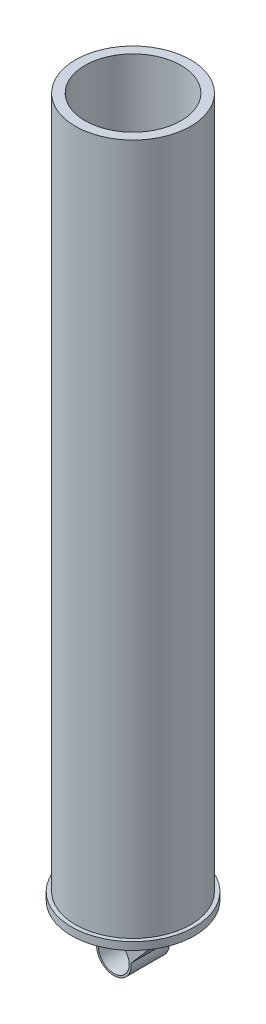
ISO-10303-21;
HEADER;
FILE_DESCRIPTION(('STEP AP214'),'2;1');
FILE_NAME('part.step','',(''),(''),'','','');
FILE_SCHEMA(('AUTOMOTIVE_DESIGN { 1 0 10303 214 1 1 1 1 }'));
ENDSEC;
DATA;
#1=APPLICATION_CONTEXT('core data for automotive mechanical design processes');
#2=APPLICATION_PROTOCOL_DEFINITION('international standard','automotive_design',2000,#1);
#3=PRODUCT_CONTEXT('',#1,'mechanical');
#4=PRODUCT('Part','Part','',(#3));
#5=PRODUCT_RELATED_PRODUCT_CATEGORY('part','',(#4));
#6=PRODUCT_DEFINITION_FORMATION('','',#4);
#7=PRODUCT_DEFINITION_CONTEXT('part definition',#1,'design');
#8=PRODUCT_DEFINITION('design','',#6,#7);
#9=PRODUCT_DEFINITION_SHAPE('','',#8);
#10=(LENGTH_UNIT() NAMED_UNIT(*) SI_UNIT(.MILLI.,.METRE.));
#11=(NAMED_UNIT(*) PLANE_ANGLE_UNIT() SI_UNIT($,.RADIAN.));
#12=(NAMED_UNIT(*) SI_UNIT($,.STERADIAN.) SOLID_ANGLE_UNIT());
#13=UNCERTAINTY_MEASURE_WITH_UNIT(LENGTH_MEASURE(1.E-05),#10,'distance_accuracy_value','');
#14=(GEOMETRIC_REPRESENTATION_CONTEXT(3) GLOBAL_UNCERTAINTY_ASSIGNED_CONTEXT((#13)) GLOBAL_UNIT_ASSIGNED_CONTEXT((#10,
#11,#12)) REPRESENTATION_CONTEXT('',''));
#15=CARTESIAN_POINT('',(0.,0.,0.));
#16=DIRECTION('',(0.,0.,1.));
#17=DIRECTION('',(1.,0.,0.));
#18=AXIS2_PLACEMENT_3D('',#15,#16,#17);
#19=CARTESIAN_POINT('',(0.,1800.,0.));
#20=DIRECTION('',(0.,1.,0.));
#21=DIRECTION('',(0.,0.,1.));
#22=AXIS2_PLACEMENT_3D('',#19,#20,#21);
#23=PLANE('',#22);
#24=CARTESIAN_POINT('',(0.,1800.,0.));
#25=DIRECTION('',(0.,1.,0.));
#26=DIRECTION('',(0.,0.,1.));
#27=AXIS2_PLACEMENT_3D('',#24,#25,#26);
#28=CIRCLE('',#27,150.);
#29=CARTESIAN_POINT('',(0.,1800.,150.));
#30=VERTEX_POINT('',#29);
#31=EDGE_CURVE('E11',#30,#30,#28,.T.);
#32=ORIENTED_EDGE('',*,*,#31,.T.);
#33=EDGE_LOOP('',(#32));
#34=FACE_BOUND('',#33,.T.);
#35=CARTESIAN_POINT('',(0.,1800.,0.));
#36=DIRECTION('',(0.,1.,0.));
#37=DIRECTION('',(0.,0.,1.));
#38=AXIS2_PLACEMENT_3D('',#35,#36,#37);
#39=CIRCLE('',#38,125.);
#40=CARTESIAN_POINT('',(0.,1800.,125.));
#41=VERTEX_POINT('',#40);
#42=EDGE_CURVE('E44',#41,#41,#39,.T.);
#43=ORIENTED_EDGE('',*,*,#42,.F.);
#44=EDGE_LOOP('',(#43));
#45=FACE_BOUND('',#44,.T.);
#46=ADVANCED_FACE('F35',(#34,#45),#23,.T.);
#47=CARTESIAN_POINT('',(0.,1800.,0.));
#48=DIRECTION('',(0.,-1.,0.));
#49=DIRECTION('',(0.,0.,-1.));
#50=AXIS2_PLACEMENT_3D('',#47,#48,#49);
#51=CYLINDRICAL_SURFACE('',#50,150.);
#52=ORIENTED_EDGE('',*,*,#31,.F.);
#53=EDGE_LOOP('',(#52));
#54=FACE_BOUND('',#53,.T.);
#55=CARTESIAN_POINT('',(0.,0.,0.));
#56=DIRECTION('',(0.,1.,0.));
#57=DIRECTION('',(0.,0.,1.));
#58=AXIS2_PLACEMENT_3D('',#55,#56,#57);
#59=CIRCLE('',#58,150.);
#60=CARTESIAN_POINT('',(0.,0.,150.));
#61=VERTEX_POINT('',#60);
#62=EDGE_CURVE('E39',#61,#61,#59,.T.);
#63=ORIENTED_EDGE('',*,*,#62,.T.);
#64=EDGE_LOOP('',(#63));
#65=FACE_BOUND('',#64,.T.);
#66=ADVANCED_FACE('F37',(#54,#65),#51,.T.);
#67=CARTESIAN_POINT('',(0.,1800.,0.));
#68=DIRECTION('',(0.,-1.,0.));
#69=DIRECTION('',(0.,0.,-1.));
#70=AXIS2_PLACEMENT_3D('',#67,#68,#69);
#71=CYLINDRICAL_SURFACE('',#70,125.);
#72=ORIENTED_EDGE('',*,*,#42,.T.);
#73=EDGE_LOOP('',(#72));
#74=FACE_BOUND('',#73,.T.);
#75=CARTESIAN_POINT('',(0.,0.,0.));
#76=DIRECTION('',(0.,1.,0.));
#77=DIRECTION('',(0.,0.,1.));
#78=AXIS2_PLACEMENT_3D('',#75,#76,#77);
#79=CIRCLE('',#78,125.);
#80=CARTESIAN_POINT('',(0.,0.,125.));
#81=VERTEX_POINT('',#80);
#82=EDGE_CURVE('E132',#81,#81,#79,.T.);
#83=ORIENTED_EDGE('',*,*,#82,.F.);
#84=EDGE_LOOP('',(#83));
#85=FACE_BOUND('',#84,.T.);
#86=ADVANCED_FACE('F157',(#74,#85),#71,.F.);
#87=CARTESIAN_POINT('',(0.,0.,0.));
#88=DIRECTION('',(0.,-1.,0.));
#89=DIRECTION('',(0.,0.,-1.));
#90=AXIS2_PLACEMENT_3D('',#87,#88,#89);
#91=PLANE('',#90);
#92=ORIENTED_EDGE('',*,*,#82,.T.);
#93=EDGE_LOOP('',(#92));
#94=FACE_BOUND('',#93,.T.);
#95=ADVANCED_FACE('F145',(#94),#91,.F.);
#96=CARTESIAN_POINT('',(0.,-20.,0.));
#97=DIRECTION('',(0.,1.,0.));
#98=DIRECTION('',(0.,0.,1.));
#99=AXIS2_PLACEMENT_3D('',#96,#97,#98);
#100=CYLINDRICAL_SURFACE('',#99,160.);
#101=CARTESIAN_POINT('',(0.,-20.,0.));
#102=DIRECTION('',(0.,-1.,0.));
#103=DIRECTION('',(0.,0.,-1.));
#104=AXIS2_PLACEMENT_3D('',#101,#102,#103);
#105=CIRCLE('',#104,160.);
#106=CARTESIAN_POINT('',(0.,-20.,-160.));
#107=VERTEX_POINT('',#106);
#108=EDGE_CURVE('E125',#107,#107,#105,.T.);
#109=ORIENTED_EDGE('',*,*,#108,.F.);
#110=EDGE_LOOP('',(#109));
#111=FACE_BOUND('',#110,.T.);
#112=CARTESIAN_POINT('',(0.,0.,0.));
#113=DIRECTION('',(0.,-1.,0.));
#114=DIRECTION('',(0.,0.,-1.));
#115=AXIS2_PLACEMENT_3D('',#112,#113,#114);
#116=CIRCLE('',#115,160.);
#117=CARTESIAN_POINT('',(0.,0.,-160.));
#118=VERTEX_POINT('',#117);
#119=EDGE_CURVE('E124',#118,#118,#116,.T.);
#120=ORIENTED_EDGE('',*,*,#119,.T.);
#121=EDGE_LOOP('',(#120));
#122=FACE_BOUND('',#121,.T.);
#123=ADVANCED_FACE('F148',(#111,#122),#100,.T.);
#124=CARTESIAN_POINT('',(0.,-20.,0.));
#125=DIRECTION('',(0.,-1.,0.));
#126=DIRECTION('',(0.,0.,-1.));
#127=AXIS2_PLACEMENT_3D('',#124,#125,#126);
#128=PLANE('',#127);
#129=DIRECTION('',(1.,0.,0.));
#130=VECTOR('',#129,1.);
#131=CARTESIAN_POINT('',(0.,-20.,-50.));
#132=LINE('',#131,#130);
#133=CARTESIAN_POINT('',(-123.818976335371,-20.,-50.));
#134=VERTEX_POINT('',#133);
#135=CARTESIAN_POINT('',(126.469944209267,-20.,-50.));
#136=VERTEX_POINT('',#135);
#137=EDGE_CURVE('E51',#134,#136,#132,.T.);
#138=ORIENTED_EDGE('',*,*,#137,.F.);
#139=DIRECTION('',(0.,0.,-1.));
#140=VECTOR('',#139,1.);
#141=CARTESIAN_POINT('',(-123.818976335371,-20.,50.));
#142=LINE('',#141,#140);
#143=CARTESIAN_POINT('',(-123.818976335371,-20.,50.));
#144=VERTEX_POINT('',#143);
#145=EDGE_CURVE('E99',#144,#134,#142,.T.);
#146=ORIENTED_EDGE('',*,*,#145,.F.);
#147=DIRECTION('',(1.,0.,0.));
#148=VECTOR('',#147,1.);
#149=CARTESIAN_POINT('',(0.,-20.,50.));
#150=LINE('',#149,#148);
#151=CARTESIAN_POINT('',(126.469944209267,-20.,50.));
#152=VERTEX_POINT('',#151);
#153=EDGE_CURVE('E89',#144,#152,#150,.T.);
#154=ORIENTED_EDGE('',*,*,#153,.T.);
#155=DIRECTION('',(0.,0.,-1.));
#156=VECTOR('',#155,1.);
#157=CARTESIAN_POINT('',(126.469944209267,-20.,50.));
#158=LINE('',#157,#156);
#159=EDGE_CURVE('E94',#152,#136,#158,.T.);
#160=ORIENTED_EDGE('',*,*,#159,.T.);
#161=EDGE_LOOP('',(#138,#146,#154,#160));
#162=FACE_BOUND('',#161,.T.);
#163=ORIENTED_EDGE('',*,*,#108,.T.);
#164=EDGE_LOOP('',(#163));
#165=FACE_BOUND('',#164,.T.);
#166=ADVANCED_FACE('F102',(#162,#165),#128,.T.);
#167=ORIENTED_EDGE('',*,*,#62,.F.);
#168=EDGE_LOOP('',(#167));
#169=FACE_BOUND('',#168,.T.);
#170=ORIENTED_EDGE('',*,*,#119,.F.);
#171=EDGE_LOOP('',(#170));
#172=FACE_BOUND('',#171,.T.);
#173=ADVANCED_FACE('F140',(#169,#172),#91,.F.);
#174=CARTESIAN_POINT('',(0.,-119.791280472536,50.));
#175=DIRECTION('',(0.,0.,-1.));
#176=DIRECTION('',(-1.,0.,0.));
#177=AXIS2_PLACEMENT_3D('',#174,#175,#176);
#178=CYLINDRICAL_SURFACE('',#177,45.);
#179=CARTESIAN_POINT('',(0.,-119.791280472536,-50.));
#180=DIRECTION('',(0.,0.,1.));
#181=DIRECTION('',(1.,0.,0.));
#182=AXIS2_PLACEMENT_3D('',#179,#180,#181);
#183=CIRCLE('',#182,45.);
#184=CARTESIAN_POINT('',(-44.6571141967103,-114.246719928906,-50.));
#185=VERTEX_POINT('',#184);
#186=CARTESIAN_POINT('',(44.6753535547206,-114.395654025059,-50.));
#187=VERTEX_POINT('',#186);
#188=EDGE_CURVE('E112',#185,#187,#183,.T.);
#189=ORIENTED_EDGE('',*,*,#188,.T.);
#190=DIRECTION('',(0.,0.,-1.));
#191=VECTOR('',#190,1.);
#192=CARTESIAN_POINT('',(44.6753535547206,-114.395654025059,50.));
#193=LINE('',#192,#191);
#194=CARTESIAN_POINT('',(44.6753535547206,-114.395654025059,50.));
#195=VERTEX_POINT('',#194);
#196=EDGE_CURVE('E98',#195,#187,#193,.T.);
#197=ORIENTED_EDGE('',*,*,#196,.F.);
#198=CARTESIAN_POINT('',(0.,-119.791280472536,50.));
#199=DIRECTION('',(0.,0.,1.));
#200=DIRECTION('',(1.,0.,0.));
#201=AXIS2_PLACEMENT_3D('',#198,#199,#200);
#202=CIRCLE('',#201,45.);
#203=CARTESIAN_POINT('',(-44.6571141967103,-114.246719928906,50.));
#204=VERTEX_POINT('',#203);
#205=EDGE_CURVE('E90',#204,#195,#202,.T.);
#206=ORIENTED_EDGE('',*,*,#205,.F.);
#207=DIRECTION('',(0.,0.,-1.));
#208=VECTOR('',#207,1.);
#209=CARTESIAN_POINT('',(-44.6571141967103,-114.246719928906,50.));
#210=LINE('',#209,#208);
#211=EDGE_CURVE('E60',#204,#185,#210,.T.);
#212=ORIENTED_EDGE('',*,*,#211,.T.);
#213=EDGE_LOOP('',(#189,#197,#206,#212));
#214=FACE_BOUND('',#213,.T.);
#215=ADVANCED_FACE('F143',(#214),#178,.T.);
#216=CARTESIAN_POINT('',(82.1322460735692,-71.1682493914674,50.));
#217=DIRECTION('',(-0.755748421979986,0.654862063853726,0.));
#218=DIRECTION('',(-0.654862063853726,-0.755748421979986,0.));
#219=AXIS2_PLACEMENT_3D('',#216,#217,#218);
#220=PLANE('',#219);
#221=DIRECTION('',(0.654862063853726,0.755748421979986,0.));
#222=VECTOR('',#221,1.);
#223=CARTESIAN_POINT('',(82.1322460735692,-71.1682493914674,-50.));
#224=LINE('',#223,#222);
#225=EDGE_CURVE('E96',#187,#136,#224,.T.);
#226=ORIENTED_EDGE('',*,*,#225,.T.);
#227=ORIENTED_EDGE('',*,*,#159,.F.);
#228=DIRECTION('',(0.654862063853726,0.755748421979986,0.));
#229=VECTOR('',#228,1.);
#230=CARTESIAN_POINT('',(82.1322460735692,-71.1682493914674,50.));
#231=LINE('',#230,#229);
#232=EDGE_CURVE('E82',#195,#152,#231,.T.);
#233=ORIENTED_EDGE('',*,*,#232,.F.);
#234=ORIENTED_EDGE('',*,*,#196,.T.);
#235=EDGE_LOOP('',(#226,#227,#233,#234));
#236=FACE_BOUND('',#235,.T.);
#237=ADVANCED_FACE('F95',(#236),#220,.F.);
#238=CARTESIAN_POINT('',(-82.4494281636539,-69.252810820642,50.));
#239=DIRECTION('',(-0.765726402178874,-0.643166445802483,0.));
#240=DIRECTION('',(0.643166445802483,-0.765726402178874,0.));
#241=AXIS2_PLACEMENT_3D('',#238,#239,#240);
#242=PLANE('',#241);
#243=DIRECTION('',(-0.643166445802483,0.765726402178874,0.));
#244=VECTOR('',#243,1.);
#245=CARTESIAN_POINT('',(-82.4494281636539,-69.252810820642,-50.));
#246=LINE('',#245,#244);
#247=EDGE_CURVE('E116',#185,#134,#246,.T.);
#248=ORIENTED_EDGE('',*,*,#247,.F.);
#249=ORIENTED_EDGE('',*,*,#211,.F.);
#250=DIRECTION('',(-0.643166445802483,0.765726402178874,0.));
#251=VECTOR('',#250,1.);
#252=CARTESIAN_POINT('',(-82.4494281636539,-69.252810820642,50.));
#253=LINE('',#252,#251);
#254=EDGE_CURVE('E104',#204,#144,#253,.T.);
#255=ORIENTED_EDGE('',*,*,#254,.T.);
#256=ORIENTED_EDGE('',*,*,#145,.T.);
#257=EDGE_LOOP('',(#248,#249,#255,#256));
#258=FACE_BOUND('',#257,.T.);
#259=ADVANCED_FACE('F212',(#258),#242,.T.);
#260=CARTESIAN_POINT('',(0.,-119.791280472536,50.));
#261=DIRECTION('',(0.,0.,-1.));
#262=DIRECTION('',(-1.,0.,0.));
#263=AXIS2_PLACEMENT_3D('',#260,#261,#262);
#264=CYLINDRICAL_SURFACE('',#263,40.);
#265=CARTESIAN_POINT('',(0.,-119.791280472536,50.));
#266=DIRECTION('',(0.,0.,1.));
#267=DIRECTION('',(1.,0.,0.));
#268=AXIS2_PLACEMENT_3D('',#265,#266,#267);
#269=CIRCLE('',#268,40.);
#270=CARTESIAN_POINT('',(40.,-119.791280472536,50.));
#271=VERTEX_POINT('',#270);
#272=EDGE_CURVE('E106',#271,#271,#269,.T.);
#273=ORIENTED_EDGE('',*,*,#272,.T.);
#274=EDGE_LOOP('',(#273));
#275=FACE_BOUND('',#274,.T.);
#276=CARTESIAN_POINT('',(0.,-119.791280472536,-50.));
#277=DIRECTION('',(0.,0.,1.));
#278=DIRECTION('',(1.,0.,0.));
#279=AXIS2_PLACEMENT_3D('',#276,#277,#278);
#280=CIRCLE('',#279,40.);
#281=CARTESIAN_POINT('',(40.,-119.791280472536,-50.));
#282=VERTEX_POINT('',#281);
#283=EDGE_CURVE('E118',#282,#282,#280,.T.);
#284=ORIENTED_EDGE('',*,*,#283,.F.);
#285=EDGE_LOOP('',(#284));
#286=FACE_BOUND('',#285,.T.);
#287=ADVANCED_FACE('F221',(#275,#286),#264,.F.);
#288=CARTESIAN_POINT('',(0.,0.,50.));
#289=DIRECTION('',(0.,0.,1.));
#290=DIRECTION('',(1.,0.,0.));
#291=AXIS2_PLACEMENT_3D('',#288,#289,#290);
#292=PLANE('',#291);
#293=ORIENTED_EDGE('',*,*,#205,.T.);
#294=ORIENTED_EDGE('',*,*,#232,.T.);
#295=ORIENTED_EDGE('',*,*,#153,.F.);
#296=ORIENTED_EDGE('',*,*,#254,.F.);
#297=EDGE_LOOP('',(#293,#294,#295,#296));
#298=FACE_BOUND('',#297,.T.);
#299=ORIENTED_EDGE('',*,*,#272,.F.);
#300=EDGE_LOOP('',(#299));
#301=FACE_BOUND('',#300,.T.);
#302=ADVANCED_FACE('F85',(#298,#301),#292,.T.);
#303=CARTESIAN_POINT('',(0.,0.,-50.));
#304=DIRECTION('',(0.,0.,1.));
#305=DIRECTION('',(1.,0.,0.));
#306=AXIS2_PLACEMENT_3D('',#303,#304,#305);
#307=PLANE('',#306);
#308=ORIENTED_EDGE('',*,*,#188,.F.);
#309=ORIENTED_EDGE('',*,*,#247,.T.);
#310=ORIENTED_EDGE('',*,*,#137,.T.);
#311=ORIENTED_EDGE('',*,*,#225,.F.);
#312=EDGE_LOOP('',(#308,#309,#310,#311));
#313=FACE_BOUND('',#312,.T.);
#314=ORIENTED_EDGE('',*,*,#283,.T.);
#315=EDGE_LOOP('',(#314));
#316=FACE_BOUND('',#315,.T.);
#317=ADVANCED_FACE('F240',(#313,#316),#307,.F.);
#318=CLOSED_SHELL('',(#46,#66,#86,#95,#123,#166,#173,#215,#237,#259,#287,#302,#317));
#319=MANIFOLD_SOLID_BREP('B2',#318);
#320=ADVANCED_BREP_SHAPE_REPRESENTATION('',(#18,#319),#14);
#321=SHAPE_DEFINITION_REPRESENTATION(#9,#320);
ENDSEC;
END-ISO-10303-21;
